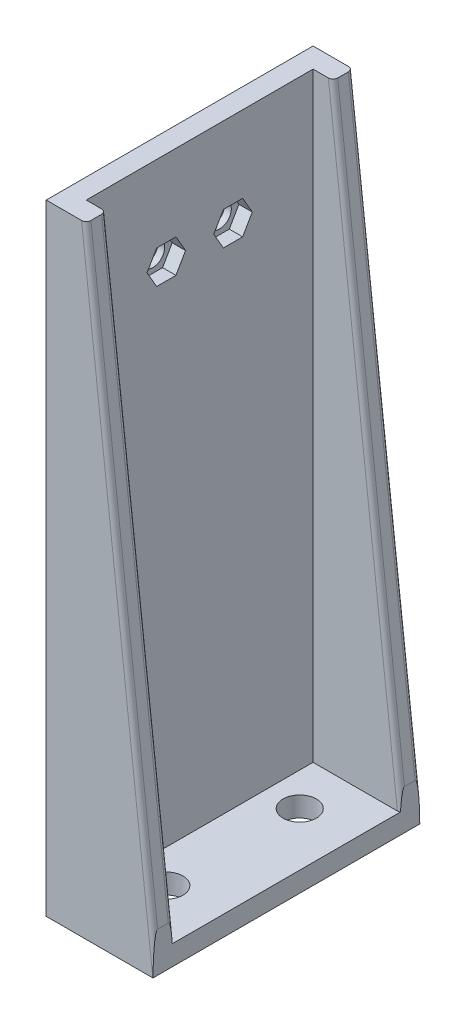
ISO-10303-21;
HEADER;
FILE_DESCRIPTION(('STEP AP214'),'2;1');
FILE_NAME('part.step','',(''),(''),'','','');
FILE_SCHEMA(('AUTOMOTIVE_DESIGN { 1 0 10303 214 1 1 1 1 }'));
ENDSEC;
DATA;
#1=APPLICATION_CONTEXT('core data for automotive mechanical design processes');
#2=APPLICATION_PROTOCOL_DEFINITION('international standard','automotive_design',2000,#1);
#3=PRODUCT_CONTEXT('',#1,'mechanical');
#4=PRODUCT('Part','Part','',(#3));
#5=PRODUCT_RELATED_PRODUCT_CATEGORY('part','',(#4));
#6=PRODUCT_DEFINITION_FORMATION('','',#4);
#7=PRODUCT_DEFINITION_CONTEXT('part definition',#1,'design');
#8=PRODUCT_DEFINITION('design','',#6,#7);
#9=PRODUCT_DEFINITION_SHAPE('','',#8);
#10=(LENGTH_UNIT() NAMED_UNIT(*) SI_UNIT(.MILLI.,.METRE.));
#11=(NAMED_UNIT(*) PLANE_ANGLE_UNIT() SI_UNIT($,.RADIAN.));
#12=(NAMED_UNIT(*) SI_UNIT($,.STERADIAN.) SOLID_ANGLE_UNIT());
#13=UNCERTAINTY_MEASURE_WITH_UNIT(LENGTH_MEASURE(1.E-05),#10,'distance_accuracy_value','');
#14=(GEOMETRIC_REPRESENTATION_CONTEXT(3) GLOBAL_UNCERTAINTY_ASSIGNED_CONTEXT((#13)) GLOBAL_UNIT_ASSIGNED_CONTEXT((#10,
#11,#12)) REPRESENTATION_CONTEXT('',''));
#15=CARTESIAN_POINT('',(0.,0.,0.));
#16=DIRECTION('',(0.,0.,1.));
#17=DIRECTION('',(1.,0.,0.));
#18=AXIS2_PLACEMENT_3D('',#15,#16,#17);
#19=CARTESIAN_POINT('',(0.,3.,0.));
#20=DIRECTION('',(0.,0.,-1.));
#21=DIRECTION('',(-1.,0.,0.));
#22=AXIS2_PLACEMENT_3D('',#19,#20,#21);
#23=PLANE('',#22);
#24=DIRECTION('',(1.,0.,0.));
#25=VECTOR('',#24,1.);
#26=CARTESIAN_POINT('',(0.,0.,0.));
#27=LINE('',#26,#25);
#28=CARTESIAN_POINT('',(-8.,0.,0.));
#29=VERTEX_POINT('',#28);
#30=CARTESIAN_POINT('',(7.98504622086198,0.,0.));
#31=VERTEX_POINT('',#30);
#32=EDGE_CURVE('E414',#29,#31,#27,.T.);
#33=ORIENTED_EDGE('',*,*,#32,.T.);
#34=DIRECTION('',(0.114190672624496,-0.993458851833112,0.));
#35=VECTOR('',#34,1.);
#36=CARTESIAN_POINT('',(-2.69542119628317,92.9200665291629,0.));
#37=LINE('',#36,#35);
#38=CARTESIAN_POINT('',(-2.70460895155181,93.,0.));
#39=VERTEX_POINT('',#38);
#40=EDGE_CURVE('E500',#31,#39,#37,.F.);
#41=ORIENTED_EDGE('',*,*,#40,.T.);
#42=DIRECTION('',(1.,0.,0.));
#43=VECTOR('',#42,1.);
#44=CARTESIAN_POINT('',(0.,93.,0.));
#45=LINE('',#44,#43);
#46=CARTESIAN_POINT('',(-8.,93.,0.));
#47=VERTEX_POINT('',#46);
#48=EDGE_CURVE('E464',#47,#39,#45,.T.);
#49=ORIENTED_EDGE('',*,*,#48,.F.);
#50=DIRECTION('',(0.,-1.,0.));
#51=VECTOR('',#50,1.);
#52=CARTESIAN_POINT('',(-8.,3.,0.));
#53=LINE('',#52,#51);
#54=EDGE_CURVE('E397',#47,#29,#53,.T.);
#55=ORIENTED_EDGE('',*,*,#54,.T.);
#56=EDGE_LOOP('',(#33,#41,#49,#55));
#57=FACE_BOUND('',#56,.T.);
#58=ADVANCED_FACE('F43',(#57),#23,.F.);
#59=CARTESIAN_POINT('',(8.,3.,0.));
#60=DIRECTION('',(-1.,0.,0.));
#61=DIRECTION('',(0.,0.,1.));
#62=AXIS2_PLACEMENT_3D('',#59,#60,#61);
#63=PLANE('',#62);
#64=DIRECTION('',(0.,0.,-1.));
#65=VECTOR('',#64,1.);
#66=CARTESIAN_POINT('',(8.,0.,0.));
#67=LINE('',#66,#65);
#68=CARTESIAN_POINT('',(8.,0.,-0.00015766037906016));
#69=VERTEX_POINT('',#68);
#70=CARTESIAN_POINT('',(8.,0.,-39.9998423396209));
#71=VERTEX_POINT('',#70);
#72=EDGE_CURVE('E410',#69,#71,#67,.T.);
#73=ORIENTED_EDGE('',*,*,#72,.T.);
#74=CARTESIAN_POINT('',(8.,-0.130097878500801,-39.3));
#75=DIRECTION('',(-1.,0.,0.));
#76=DIRECTION('',(0.,-1.,0.));
#77=AXIS2_PLACEMENT_3D('',#74,#75,#76);
#78=ELLIPSE('',#77,6.1300978785008,0.7);
#79=CARTESIAN_POINT('',(8.,5.99999999999999,-39.3));
#80=VERTEX_POINT('',#79);
#81=EDGE_CURVE('E535',#71,#80,#78,.F.);
#82=ORIENTED_EDGE('',*,*,#81,.T.);
#83=DIRECTION('',(0.,0.,-1.));
#84=VECTOR('',#83,1.);
#85=CARTESIAN_POINT('',(8.00000000000001,5.99999999999999,0.));
#86=LINE('',#85,#84);
#87=CARTESIAN_POINT('',(8.,5.99999999999999,-37.7));
#88=VERTEX_POINT('',#87);
#89=EDGE_CURVE('E321',#88,#80,#86,.T.);
#90=ORIENTED_EDGE('',*,*,#89,.F.);
#91=CARTESIAN_POINT('',(8.,-0.130097878500797,-37.7));
#92=DIRECTION('',(-1.,0.,0.));
#93=DIRECTION('',(0.,1.,0.));
#94=AXIS2_PLACEMENT_3D('',#91,#92,#93);
#95=ELLIPSE('',#94,6.1300978785008,0.7);
#96=CARTESIAN_POINT('',(8.,3.,-37.0981318769091));
#97=VERTEX_POINT('',#96);
#98=EDGE_CURVE('E538',#88,#97,#95,.F.);
#99=ORIENTED_EDGE('',*,*,#98,.T.);
#100=DIRECTION('',(0.,0.,-1.));
#101=VECTOR('',#100,1.);
#102=CARTESIAN_POINT('',(8.,3.,0.));
#103=LINE('',#102,#101);
#104=CARTESIAN_POINT('',(8.,3.,-2.90186812309091));
#105=VERTEX_POINT('',#104);
#106=EDGE_CURVE('E400',#105,#97,#103,.T.);
#107=ORIENTED_EDGE('',*,*,#106,.F.);
#108=CARTESIAN_POINT('',(8.,-0.130097878500754,-2.3));
#109=DIRECTION('',(-1.,0.,0.));
#110=DIRECTION('',(0.,-1.,0.));
#111=AXIS2_PLACEMENT_3D('',#108,#109,#110);
#112=ELLIPSE('',#111,6.1300978785008,0.7);
#113=CARTESIAN_POINT('',(8.00000000000001,5.99999999999999,-2.3));
#114=VERTEX_POINT('',#113);
#115=EDGE_CURVE('E337',#105,#114,#112,.F.);
#116=ORIENTED_EDGE('',*,*,#115,.T.);
#117=CARTESIAN_POINT('',(8.00000000000001,5.99999999999999,-0.700000000000001));
#118=VERTEX_POINT('',#117);
#119=EDGE_CURVE('E330',#118,#114,#86,.T.);
#120=ORIENTED_EDGE('',*,*,#119,.F.);
#121=CARTESIAN_POINT('',(8.,-0.130097878500748,-0.700000000000001));
#122=DIRECTION('',(-1.,0.,0.));
#123=DIRECTION('',(0.,1.,0.));
#124=AXIS2_PLACEMENT_3D('',#121,#122,#123);
#125=ELLIPSE('',#124,6.1300978785008,0.7);
#126=EDGE_CURVE('E498',#118,#69,#125,.F.);
#127=ORIENTED_EDGE('',*,*,#126,.T.);
#128=EDGE_LOOP('',(#73,#82,#90,#99,#107,#116,#120,#127));
#129=FACE_BOUND('',#128,.T.);
#130=ADVANCED_FACE('F546',(#129),#63,.F.);
#131=CARTESIAN_POINT('',(0.,3.,-40.));
#132=DIRECTION('',(0.,0.,-1.));
#133=DIRECTION('',(-1.,0.,0.));
#134=AXIS2_PLACEMENT_3D('',#131,#132,#133);
#135=PLANE('',#134);
#136=DIRECTION('',(-1.,0.,0.));
#137=VECTOR('',#136,1.);
#138=CARTESIAN_POINT('',(0.,93.,-40.));
#139=LINE('',#138,#137);
#140=CARTESIAN_POINT('',(-2.70460895155182,93.,-40.));
#141=VERTEX_POINT('',#140);
#142=CARTESIAN_POINT('',(-8.,93.,-40.));
#143=VERTEX_POINT('',#142);
#144=EDGE_CURVE('E324',#141,#143,#139,.T.);
#145=ORIENTED_EDGE('',*,*,#144,.F.);
#146=DIRECTION('',(0.114190672624496,-0.993458851833112,0.));
#147=VECTOR('',#146,1.);
#148=CARTESIAN_POINT('',(7.54059392954809,3.86673493443081,-40.));
#149=LINE('',#148,#147);
#150=CARTESIAN_POINT('',(7.98504622086197,0.,-40.));
#151=VERTEX_POINT('',#150);
#152=EDGE_CURVE('E341',#141,#151,#149,.T.);
#153=ORIENTED_EDGE('',*,*,#152,.T.);
#154=DIRECTION('',(1.,0.,0.));
#155=VECTOR('',#154,1.);
#156=CARTESIAN_POINT('',(0.,0.,-40.));
#157=LINE('',#156,#155);
#158=CARTESIAN_POINT('',(-8.,0.,-40.));
#159=VERTEX_POINT('',#158);
#160=EDGE_CURVE('E406',#159,#151,#157,.T.);
#161=ORIENTED_EDGE('',*,*,#160,.F.);
#162=DIRECTION('',(0.,-1.,0.));
#163=VECTOR('',#162,1.);
#164=CARTESIAN_POINT('',(-8.,3.,-40.));
#165=LINE('',#164,#163);
#166=EDGE_CURVE('E394',#143,#159,#165,.T.);
#167=ORIENTED_EDGE('',*,*,#166,.F.);
#168=EDGE_LOOP('',(#145,#153,#161,#167));
#169=FACE_BOUND('',#168,.T.);
#170=ADVANCED_FACE('F482',(#169),#135,.T.);
#171=CARTESIAN_POINT('',(0.,93.,-3.));
#172=DIRECTION('',(0.,0.,-1.));
#173=DIRECTION('',(-1.,0.,0.));
#174=AXIS2_PLACEMENT_3D('',#171,#172,#173);
#175=PLANE('',#174);
#176=DIRECTION('',(1.,0.,0.));
#177=VECTOR('',#176,1.);
#178=CARTESIAN_POINT('',(0.,93.,-3.));
#179=LINE('',#178,#177);
#180=CARTESIAN_POINT('',(-5.,93.,-3.));
#181=VERTEX_POINT('',#180);
#182=CARTESIAN_POINT('',(-2.70460895155181,93.,-3.));
#183=VERTEX_POINT('',#182);
#184=EDGE_CURVE('E460',#181,#183,#179,.T.);
#185=ORIENTED_EDGE('',*,*,#184,.T.);
#186=DIRECTION('',(0.114190672624496,-0.993458851833112,0.));
#187=VECTOR('',#186,1.);
#188=CARTESIAN_POINT('',(-2.6693421768543,92.6931790601317,-3.));
#189=LINE('',#188,#187);
#190=CARTESIAN_POINT('',(7.64021863465509,3.,-3.));
#191=VERTEX_POINT('',#190);
#192=EDGE_CURVE('E503',#183,#191,#189,.T.);
#193=ORIENTED_EDGE('',*,*,#192,.T.);
#194=DIRECTION('',(-1.,0.,0.));
#195=VECTOR('',#194,1.);
#196=CARTESIAN_POINT('',(0.,3.,-3.));
#197=LINE('',#196,#195);
#198=CARTESIAN_POINT('',(-5.,3.,-3.));
#199=VERTEX_POINT('',#198);
#200=EDGE_CURVE('E426',#191,#199,#197,.T.);
#201=ORIENTED_EDGE('',*,*,#200,.T.);
#202=DIRECTION('',(0.,-1.,0.));
#203=VECTOR('',#202,1.);
#204=CARTESIAN_POINT('',(-5.,93.,-3.));
#205=LINE('',#204,#203);
#206=EDGE_CURVE('E445',#181,#199,#205,.T.);
#207=ORIENTED_EDGE('',*,*,#206,.F.);
#208=EDGE_LOOP('',(#185,#193,#201,#207));
#209=FACE_BOUND('',#208,.T.);
#210=ADVANCED_FACE('F554',(#209),#175,.T.);
#211=CARTESIAN_POINT('',(0.,93.,-37.));
#212=DIRECTION('',(0.,0.,-1.));
#213=DIRECTION('',(-1.,0.,0.));
#214=AXIS2_PLACEMENT_3D('',#211,#212,#213);
#215=PLANE('',#214);
#216=DIRECTION('',(-1.,0.,0.));
#217=VECTOR('',#216,1.);
#218=CARTESIAN_POINT('',(0.,3.,-37.));
#219=LINE('',#218,#217);
#220=CARTESIAN_POINT('',(7.64021863465508,3.,-37.));
#221=VERTEX_POINT('',#220);
#222=CARTESIAN_POINT('',(-5.,3.,-37.));
#223=VERTEX_POINT('',#222);
#224=EDGE_CURVE('E442',#221,#223,#219,.T.);
#225=ORIENTED_EDGE('',*,*,#224,.F.);
#226=DIRECTION('',(0.114190672624496,-0.993458851833112,0.));
#227=VECTOR('',#226,1.);
#228=CARTESIAN_POINT('',(-2.69542119628319,92.9200665291629,-37.));
#229=LINE('',#228,#227);
#230=CARTESIAN_POINT('',(-2.70460895155182,93.,-37.));
#231=VERTEX_POINT('',#230);
#232=EDGE_CURVE('E515',#221,#231,#229,.F.);
#233=ORIENTED_EDGE('',*,*,#232,.T.);
#234=DIRECTION('',(1.,0.,0.));
#235=VECTOR('',#234,1.);
#236=CARTESIAN_POINT('',(0.,93.,-37.));
#237=LINE('',#236,#235);
#238=CARTESIAN_POINT('',(-5.,93.,-37.));
#239=VERTEX_POINT('',#238);
#240=EDGE_CURVE('E453',#239,#231,#237,.T.);
#241=ORIENTED_EDGE('',*,*,#240,.F.);
#242=DIRECTION('',(0.,-1.,0.));
#243=VECTOR('',#242,1.);
#244=CARTESIAN_POINT('',(-5.,93.,-37.));
#245=LINE('',#244,#243);
#246=EDGE_CURVE('E449',#239,#223,#245,.T.);
#247=ORIENTED_EDGE('',*,*,#246,.T.);
#248=EDGE_LOOP('',(#225,#233,#241,#247));
#249=FACE_BOUND('',#248,.T.);
#250=ADVANCED_FACE('F630',(#249),#215,.F.);
#251=CARTESIAN_POINT('',(0.,93.,0.));
#252=DIRECTION('',(0.,1.,0.));
#253=DIRECTION('',(0.,0.,1.));
#254=AXIS2_PLACEMENT_3D('',#251,#252,#253);
#255=PLANE('',#254);
#256=DIRECTION('',(0.,0.,-1.));
#257=VECTOR('',#256,1.);
#258=CARTESIAN_POINT('',(-1.99999999999999,93.,0.));
#259=LINE('',#258,#257);
#260=CARTESIAN_POINT('',(-2.,93.,-37.7));
#261=VERTEX_POINT('',#260);
#262=CARTESIAN_POINT('',(-2.,93.,-39.3));
#263=VERTEX_POINT('',#262);
#264=EDGE_CURVE('E390',#261,#263,#259,.T.);
#265=ORIENTED_EDGE('',*,*,#264,.T.);
#266=CARTESIAN_POINT('',(-2.70460895155182,93.,-39.3));
#267=DIRECTION('',(0.,1.,0.));
#268=DIRECTION('',(1.,0.,0.));
#269=AXIS2_PLACEMENT_3D('',#266,#267,#268);
#270=ELLIPSE('',#269,0.704608951551816,0.7);
#271=EDGE_CURVE('E478',#263,#141,#270,.T.);
#272=ORIENTED_EDGE('',*,*,#271,.T.);
#273=ORIENTED_EDGE('',*,*,#144,.T.);
#274=DIRECTION('',(0.,0.,1.));
#275=VECTOR('',#274,1.);
#276=CARTESIAN_POINT('',(-8.,93.,0.));
#277=LINE('',#276,#275);
#278=EDGE_CURVE('E467',#143,#47,#277,.T.);
#279=ORIENTED_EDGE('',*,*,#278,.T.);
#280=ORIENTED_EDGE('',*,*,#48,.T.);
#281=CARTESIAN_POINT('',(-2.70460895155181,93.,-0.699999999999999));
#282=DIRECTION('',(0.,1.,0.));
#283=DIRECTION('',(-1.,0.,0.));
#284=AXIS2_PLACEMENT_3D('',#281,#282,#283);
#285=ELLIPSE('',#284,0.704608951551816,0.7);
#286=CARTESIAN_POINT('',(-1.99999999999999,93.,-0.7));
#287=VERTEX_POINT('',#286);
#288=EDGE_CURVE('E501',#39,#287,#285,.T.);
#289=ORIENTED_EDGE('',*,*,#288,.T.);
#290=DIRECTION('',(0.,0.,-1.));
#291=VECTOR('',#290,1.);
#292=CARTESIAN_POINT('',(-1.99999999999999,93.,0.));
#293=LINE('',#292,#291);
#294=CARTESIAN_POINT('',(-1.99999999999999,93.,-2.3));
#295=VERTEX_POINT('',#294);
#296=EDGE_CURVE('E268',#287,#295,#293,.T.);
#297=ORIENTED_EDGE('',*,*,#296,.T.);
#298=CARTESIAN_POINT('',(-2.70460895155181,93.,-2.3));
#299=DIRECTION('',(0.,1.,0.));
#300=DIRECTION('',(1.,0.,0.));
#301=AXIS2_PLACEMENT_3D('',#298,#299,#300);
#302=ELLIPSE('',#301,0.704608951551816,0.7);
#303=EDGE_CURVE('E525',#295,#183,#302,.T.);
#304=ORIENTED_EDGE('',*,*,#303,.T.);
#305=ORIENTED_EDGE('',*,*,#184,.F.);
#306=DIRECTION('',(0.,0.,-1.));
#307=VECTOR('',#306,1.);
#308=CARTESIAN_POINT('',(-5.,93.,0.));
#309=LINE('',#308,#307);
#310=EDGE_CURVE('E457',#181,#239,#309,.T.);
#311=ORIENTED_EDGE('',*,*,#310,.T.);
#312=ORIENTED_EDGE('',*,*,#240,.T.);
#313=CARTESIAN_POINT('',(-2.70460895155182,93.,-37.7));
#314=DIRECTION('',(0.,1.,0.));
#315=DIRECTION('',(-1.,0.,0.));
#316=AXIS2_PLACEMENT_3D('',#313,#314,#315);
#317=ELLIPSE('',#316,0.704608951551816,0.7);
#318=EDGE_CURVE('E520',#231,#261,#317,.T.);
#319=ORIENTED_EDGE('',*,*,#318,.T.);
#320=EDGE_LOOP('',(#265,#272,#273,#279,#280,#289,#297,#304,#305,#311,#312,#319));
#321=FACE_BOUND('',#320,.T.);
#322=ADVANCED_FACE('F476',(#321),#255,.T.);
#323=CARTESIAN_POINT('',(0.,3.,-30.));
#324=DIRECTION('',(0.,-1.,0.));
#325=DIRECTION('',(0.,0.,-1.));
#326=AXIS2_PLACEMENT_3D('',#323,#324,#325);
#327=CYLINDRICAL_SURFACE('',#326,2.5);
#328=CARTESIAN_POINT('',(0.,3.,-30.));
#329=DIRECTION('',(0.,1.,0.));
#330=DIRECTION('',(0.,0.,1.));
#331=AXIS2_PLACEMENT_3D('',#328,#329,#330);
#332=CIRCLE('',#331,2.5);
#333=CARTESIAN_POINT('',(0.,3.,-27.5));
#334=VERTEX_POINT('',#333);
#335=EDGE_CURVE('E429',#334,#334,#332,.T.);
#336=ORIENTED_EDGE('',*,*,#335,.T.);
#337=EDGE_LOOP('',(#336));
#338=FACE_BOUND('',#337,.T.);
#339=CARTESIAN_POINT('',(0.,0.,-30.));
#340=DIRECTION('',(0.,1.,0.));
#341=DIRECTION('',(0.,0.,1.));
#342=AXIS2_PLACEMENT_3D('',#339,#340,#341);
#343=CIRCLE('',#342,2.5);
#344=CARTESIAN_POINT('',(0.,0.,-27.5));
#345=VERTEX_POINT('',#344);
#346=EDGE_CURVE('E418',#345,#345,#343,.T.);
#347=ORIENTED_EDGE('',*,*,#346,.F.);
#348=EDGE_LOOP('',(#347));
#349=FACE_BOUND('',#348,.T.);
#350=ADVANCED_FACE('F598',(#338,#349),#327,.F.);
#351=CARTESIAN_POINT('',(0.,3.,-10.));
#352=DIRECTION('',(0.,-1.,0.));
#353=DIRECTION('',(0.,0.,-1.));
#354=AXIS2_PLACEMENT_3D('',#351,#352,#353);
#355=CYLINDRICAL_SURFACE('',#354,2.5);
#356=CARTESIAN_POINT('',(0.,3.,-10.));
#357=DIRECTION('',(0.,1.,0.));
#358=DIRECTION('',(0.,0.,1.));
#359=AXIS2_PLACEMENT_3D('',#356,#357,#358);
#360=CIRCLE('',#359,2.5);
#361=CARTESIAN_POINT('',(0.,3.,-7.5));
#362=VERTEX_POINT('',#361);
#363=EDGE_CURVE('E405',#362,#362,#360,.T.);
#364=ORIENTED_EDGE('',*,*,#363,.T.);
#365=EDGE_LOOP('',(#364));
#366=FACE_BOUND('',#365,.T.);
#367=CARTESIAN_POINT('',(0.,0.,-10.));
#368=DIRECTION('',(0.,1.,0.));
#369=DIRECTION('',(0.,0.,1.));
#370=AXIS2_PLACEMENT_3D('',#367,#368,#369);
#371=CIRCLE('',#370,2.5);
#372=CARTESIAN_POINT('',(0.,0.,-7.5));
#373=VERTEX_POINT('',#372);
#374=EDGE_CURVE('E422',#373,#373,#371,.T.);
#375=ORIENTED_EDGE('',*,*,#374,.F.);
#376=EDGE_LOOP('',(#375));
#377=FACE_BOUND('',#376,.T.);
#378=ADVANCED_FACE('F600',(#366,#377),#355,.F.);
#379=CARTESIAN_POINT('',(-8.,3.,0.));
#380=DIRECTION('',(-1.,0.,0.));
#381=DIRECTION('',(0.,0.,1.));
#382=AXIS2_PLACEMENT_3D('',#379,#380,#381);
#383=PLANE('',#382);
#384=CARTESIAN_POINT('',(-8.,79.,-25.));
#385=DIRECTION('',(-1.,0.,0.));
#386=DIRECTION('',(0.,0.,1.));
#387=AXIS2_PLACEMENT_3D('',#384,#385,#386);
#388=CIRCLE('',#387,1.75);
#389=CARTESIAN_POINT('',(-8.,79.,-23.25));
#390=VERTEX_POINT('',#389);
#391=EDGE_CURVE('E703',#390,#390,#388,.T.);
#392=ORIENTED_EDGE('',*,*,#391,.F.);
#393=EDGE_LOOP('',(#392));
#394=FACE_BOUND('',#393,.T.);
#395=CARTESIAN_POINT('',(-8.,79.,-15.));
#396=DIRECTION('',(-1.,0.,0.));
#397=DIRECTION('',(0.,0.,1.));
#398=AXIS2_PLACEMENT_3D('',#395,#396,#397);
#399=CIRCLE('',#398,1.75);
#400=CARTESIAN_POINT('',(-8.,79.,-13.25));
#401=VERTEX_POINT('',#400);
#402=EDGE_CURVE('E698',#401,#401,#399,.T.);
#403=ORIENTED_EDGE('',*,*,#402,.F.);
#404=EDGE_LOOP('',(#403));
#405=FACE_BOUND('',#404,.T.);
#406=DIRECTION('',(0.,0.,-1.));
#407=VECTOR('',#406,1.);
#408=CARTESIAN_POINT('',(-8.,0.,0.));
#409=LINE('',#408,#407);
#410=EDGE_CURVE('E401',#29,#159,#409,.T.);
#411=ORIENTED_EDGE('',*,*,#410,.F.);
#412=ORIENTED_EDGE('',*,*,#54,.F.);
#413=ORIENTED_EDGE('',*,*,#278,.F.);
#414=ORIENTED_EDGE('',*,*,#166,.T.);
#415=EDGE_LOOP('',(#411,#412,#413,#414));
#416=FACE_BOUND('',#415,.T.);
#417=ADVANCED_FACE('F485',(#394,#405,#416),#383,.T.);
#418=CARTESIAN_POINT('',(0.,3.,0.));
#419=DIRECTION('',(0.,1.,0.));
#420=DIRECTION('',(0.,0.,1.));
#421=AXIS2_PLACEMENT_3D('',#418,#419,#420);
#422=PLANE('',#421);
#423=ORIENTED_EDGE('',*,*,#200,.F.);
#424=CARTESIAN_POINT('',(7.64021863465509,3.,-2.3));
#425=DIRECTION('',(0.,1.,0.));
#426=DIRECTION('',(1.,0.,0.));
#427=AXIS2_PLACEMENT_3D('',#424,#425,#426);
#428=ELLIPSE('',#427,0.704608951551816,0.7);
#429=EDGE_CURVE('E11',#191,#105,#428,.F.);
#430=ORIENTED_EDGE('',*,*,#429,.T.);
#431=ORIENTED_EDGE('',*,*,#106,.T.);
#432=CARTESIAN_POINT('',(7.64021863465508,3.,-37.7));
#433=DIRECTION('',(0.,1.,0.));
#434=DIRECTION('',(-1.,0.,0.));
#435=AXIS2_PLACEMENT_3D('',#432,#433,#434);
#436=ELLIPSE('',#435,0.704608951551816,0.7);
#437=EDGE_CURVE('E52',#97,#221,#436,.F.);
#438=ORIENTED_EDGE('',*,*,#437,.T.);
#439=ORIENTED_EDGE('',*,*,#224,.T.);
#440=DIRECTION('',(0.,0.,1.));
#441=VECTOR('',#440,1.);
#442=CARTESIAN_POINT('',(-5.,3.,0.));
#443=LINE('',#442,#441);
#444=EDGE_CURVE('E438',#223,#199,#443,.T.);
#445=ORIENTED_EDGE('',*,*,#444,.T.);
#446=EDGE_LOOP('',(#423,#430,#431,#438,#439,#445));
#447=FACE_BOUND('',#446,.T.);
#448=ORIENTED_EDGE('',*,*,#363,.F.);
#449=EDGE_LOOP('',(#448));
#450=FACE_BOUND('',#449,.T.);
#451=ORIENTED_EDGE('',*,*,#335,.F.);
#452=EDGE_LOOP('',(#451));
#453=FACE_BOUND('',#452,.T.);
#454=ADVANCED_FACE('F607',(#447,#450,#453),#422,.T.);
#455=CARTESIAN_POINT('',(0.,0.,0.));
#456=DIRECTION('',(0.,1.,0.));
#457=DIRECTION('',(0.,0.,1.));
#458=AXIS2_PLACEMENT_3D('',#455,#456,#457);
#459=PLANE('',#458);
#460=ORIENTED_EDGE('',*,*,#160,.T.);
#461=CARTESIAN_POINT('',(7.98504622086197,0.,-39.3));
#462=DIRECTION('',(0.,1.,0.));
#463=DIRECTION('',(1.,0.,0.));
#464=AXIS2_PLACEMENT_3D('',#461,#462,#463);
#465=ELLIPSE('',#464,0.704608951551816,0.7);
#466=EDGE_CURVE('E334',#151,#71,#465,.F.);
#467=ORIENTED_EDGE('',*,*,#466,.T.);
#468=ORIENTED_EDGE('',*,*,#72,.F.);
#469=CARTESIAN_POINT('',(7.98504622086198,0.,-0.700000000000001));
#470=DIRECTION('',(0.,1.,0.));
#471=DIRECTION('',(-1.,0.,0.));
#472=AXIS2_PLACEMENT_3D('',#469,#470,#471);
#473=ELLIPSE('',#472,0.704608951551816,0.7);
#474=EDGE_CURVE('E338',#69,#31,#473,.F.);
#475=ORIENTED_EDGE('',*,*,#474,.T.);
#476=ORIENTED_EDGE('',*,*,#32,.F.);
#477=ORIENTED_EDGE('',*,*,#410,.T.);
#478=EDGE_LOOP('',(#460,#467,#468,#475,#476,#477));
#479=FACE_BOUND('',#478,.T.);
#480=ORIENTED_EDGE('',*,*,#374,.T.);
#481=EDGE_LOOP('',(#480));
#482=FACE_BOUND('',#481,.T.);
#483=ORIENTED_EDGE('',*,*,#346,.T.);
#484=EDGE_LOOP('',(#483));
#485=FACE_BOUND('',#484,.T.);
#486=ADVANCED_FACE('F490',(#479,#482,#485),#459,.F.);
#487=CARTESIAN_POINT('',(-5.,93.,0.));
#488=DIRECTION('',(-1.,0.,0.));
#489=DIRECTION('',(0.,0.,1.));
#490=AXIS2_PLACEMENT_3D('',#487,#488,#489);
#491=PLANE('',#490);
#492=DIRECTION('',(0.,-0.866025403784439,-0.499999999999999));
#493=VECTOR('',#492,1.);
#494=CARTESIAN_POINT('',(-5.,97.2451905283833,-7.35288568297007));
#495=LINE('',#494,#493);
#496=CARTESIAN_POINT('',(-5.,81.5,-16.4433756729741));
#497=VERTEX_POINT('',#496);
#498=CARTESIAN_POINT('',(-5.,79.,-17.8867513459481));
#499=VERTEX_POINT('',#498);
#500=EDGE_CURVE('E348',#497,#499,#495,.T.);
#501=ORIENTED_EDGE('',*,*,#500,.T.);
#502=DIRECTION('',(0.,-0.866025403784437,0.500000000000003));
#503=VECTOR('',#502,1.);
#504=CARTESIAN_POINT('',(-5.,81.7548094716166,-19.4772413359522));
#505=LINE('',#504,#503);
#506=CARTESIAN_POINT('',(-5.,76.5,-16.4433756729741));
#507=VERTEX_POINT('',#506);
#508=EDGE_CURVE('E345',#499,#507,#505,.T.);
#509=ORIENTED_EDGE('',*,*,#508,.T.);
#510=DIRECTION('',(0.,0.,1.));
#511=VECTOR('',#510,1.);
#512=CARTESIAN_POINT('',(-5.,76.5,0.));
#513=LINE('',#512,#511);
#514=CARTESIAN_POINT('',(-5.,76.5,-13.5566243270259));
#515=VERTEX_POINT('',#514);
#516=EDGE_CURVE('E221',#507,#515,#513,.T.);
#517=ORIENTED_EDGE('',*,*,#516,.T.);
#518=DIRECTION('',(0.,0.866025403784439,0.499999999999999));
#519=VECTOR('',#518,1.);
#520=CARTESIAN_POINT('',(-5.,94.7451905283833,-3.02275866404785));
#521=LINE('',#520,#519);
#522=CARTESIAN_POINT('',(-5.,79.,-12.1132486540519));
#523=VERTEX_POINT('',#522);
#524=EDGE_CURVE('E360',#515,#523,#521,.T.);
#525=ORIENTED_EDGE('',*,*,#524,.T.);
#526=DIRECTION('',(0.,0.866025403784438,-0.500000000000001));
#527=VECTOR('',#526,1.);
#528=CARTESIAN_POINT('',(-5.,84.2548094716167,-15.14711431703));
#529=LINE('',#528,#527);
#530=CARTESIAN_POINT('',(-5.,81.5,-13.556624327026));
#531=VERTEX_POINT('',#530);
#532=EDGE_CURVE('E356',#523,#531,#529,.T.);
#533=ORIENTED_EDGE('',*,*,#532,.T.);
#534=DIRECTION('',(0.,0.,-1.));
#535=VECTOR('',#534,1.);
#536=CARTESIAN_POINT('',(-5.,81.5,0.));
#537=LINE('',#536,#535);
#538=EDGE_CURVE('E352',#531,#497,#537,.T.);
#539=ORIENTED_EDGE('',*,*,#538,.T.);
#540=EDGE_LOOP('',(#501,#509,#517,#525,#533,#539));
#541=FACE_BOUND('',#540,.T.);
#542=DIRECTION('',(0.,-0.866025403784439,-0.499999999999999));
#543=VECTOR('',#542,1.);
#544=CARTESIAN_POINT('',(-5.,101.575317547305,-14.85288568297));
#545=LINE('',#544,#543);
#546=CARTESIAN_POINT('',(-5.,81.5,-26.443375672974));
#547=VERTEX_POINT('',#546);
#548=CARTESIAN_POINT('',(-5.,79.,-27.8867513459481));
#549=VERTEX_POINT('',#548);
#550=EDGE_CURVE('E370',#547,#549,#545,.T.);
#551=ORIENTED_EDGE('',*,*,#550,.T.);
#552=DIRECTION('',(0.,-0.866025403784439,0.499999999999999));
#553=VECTOR('',#552,1.);
#554=CARTESIAN_POINT('',(-5.,77.4246824526945,-26.9772413359522));
#555=LINE('',#554,#553);
#556=CARTESIAN_POINT('',(-5.,76.5,-26.443375672974));
#557=VERTEX_POINT('',#556);
#558=EDGE_CURVE('E366',#549,#557,#555,.T.);
#559=ORIENTED_EDGE('',*,*,#558,.T.);
#560=DIRECTION('',(0.,0.,1.));
#561=VECTOR('',#560,1.);
#562=CARTESIAN_POINT('',(-5.,76.5,0.));
#563=LINE('',#562,#561);
#564=CARTESIAN_POINT('',(-5.,76.5,-23.5566243270259));
#565=VERTEX_POINT('',#564);
#566=EDGE_CURVE('E386',#557,#565,#563,.T.);
#567=ORIENTED_EDGE('',*,*,#566,.T.);
#568=DIRECTION('',(0.,0.866025403784439,0.5));
#569=VECTOR('',#568,1.);
#570=CARTESIAN_POINT('',(-5.,99.0753175473055,-10.5227586640478));
#571=LINE('',#570,#569);
#572=CARTESIAN_POINT('',(-5.,79.,-22.1132486540518));
#573=VERTEX_POINT('',#572);
#574=EDGE_CURVE('E382',#565,#573,#571,.T.);
#575=ORIENTED_EDGE('',*,*,#574,.T.);
#576=DIRECTION('',(0.,0.866025403784439,-0.5));
#577=VECTOR('',#576,1.);
#578=CARTESIAN_POINT('',(-5.,79.9246824526945,-22.6471143170299));
#579=LINE('',#578,#577);
#580=CARTESIAN_POINT('',(-5.,81.5,-23.5566243270259));
#581=VERTEX_POINT('',#580);
#582=EDGE_CURVE('E378',#573,#581,#579,.T.);
#583=ORIENTED_EDGE('',*,*,#582,.T.);
#584=DIRECTION('',(0.,0.,-1.));
#585=VECTOR('',#584,1.);
#586=CARTESIAN_POINT('',(-5.,81.5,0.));
#587=LINE('',#586,#585);
#588=EDGE_CURVE('E374',#581,#547,#587,.T.);
#589=ORIENTED_EDGE('',*,*,#588,.T.);
#590=EDGE_LOOP('',(#551,#559,#567,#575,#583,#589));
#591=FACE_BOUND('',#590,.T.);
#592=ORIENTED_EDGE('',*,*,#444,.F.);
#593=ORIENTED_EDGE('',*,*,#246,.F.);
#594=ORIENTED_EDGE('',*,*,#310,.F.);
#595=ORIENTED_EDGE('',*,*,#206,.T.);
#596=EDGE_LOOP('',(#592,#593,#594,#595));
#597=FACE_BOUND('',#596,.T.);
#598=ADVANCED_FACE('F560',(#541,#591,#597),#491,.F.);
#599=CARTESIAN_POINT('',(8.57634632937802,0.985786934411267,0.));
#600=DIRECTION('',(0.993458851833112,0.114190672624496,0.));
#601=DIRECTION('',(-0.114190672624496,0.993458851833112,0.));
#602=AXIS2_PLACEMENT_3D('',#599,#600,#601);
#603=PLANE('',#602);
#604=ORIENTED_EDGE('',*,*,#89,.T.);
#605=DIRECTION('',(0.114190672624496,-0.993458851833112,0.));
#606=VECTOR('',#605,1.);
#607=CARTESIAN_POINT('',(8.57634632937801,0.985786934411266,-39.3));
#608=LINE('',#607,#606);
#609=EDGE_CURVE('E528',#80,#263,#608,.F.);
#610=ORIENTED_EDGE('',*,*,#609,.T.);
#611=ORIENTED_EDGE('',*,*,#264,.F.);
#612=DIRECTION('',(0.114190672624496,-0.993458851833112,0.));
#613=VECTOR('',#612,1.);
#614=CARTESIAN_POINT('',(8.,5.99999999999999,-37.7));
#615=LINE('',#614,#613);
#616=EDGE_CURVE('E531',#261,#88,#615,.T.);
#617=ORIENTED_EDGE('',*,*,#616,.T.);
#618=EDGE_LOOP('',(#604,#610,#611,#617));
#619=FACE_BOUND('',#618,.T.);
#620=ADVANCED_FACE('F572',(#619),#603,.T.);
#621=ORIENTED_EDGE('',*,*,#296,.F.);
#622=DIRECTION('',(0.114190672624496,-0.993458851833112,0.));
#623=VECTOR('',#622,1.);
#624=CARTESIAN_POINT('',(8.00000000000001,5.99999999999999,-0.700000000000001));
#625=LINE('',#624,#623);
#626=EDGE_CURVE('E504',#287,#118,#625,.T.);
#627=ORIENTED_EDGE('',*,*,#626,.T.);
#628=ORIENTED_EDGE('',*,*,#119,.T.);
#629=DIRECTION('',(0.114190672624496,-0.993458851833112,0.));
#630=VECTOR('',#629,1.);
#631=CARTESIAN_POINT('',(8.57634632937802,0.985786934411267,-2.3));
#632=LINE('',#631,#630);
#633=EDGE_CURVE('E509',#114,#295,#632,.F.);
#634=ORIENTED_EDGE('',*,*,#633,.T.);
#635=EDGE_LOOP('',(#621,#627,#628,#634));
#636=FACE_BOUND('',#635,.T.);
#637=ADVANCED_FACE('F550',(#636),#603,.T.);
#638=CARTESIAN_POINT('',(8.00005499999999,7.67468245269448,13.2929399400242));
#639=DIRECTION('',(0.,-0.499999999999999,-0.866025403784439));
#640=DIRECTION('',(0.,0.866025403784439,-0.499999999999999));
#641=AXIS2_PLACEMENT_3D('',#638,#639,#640);
#642=PLANE('',#641);
#643=DIRECTION('',(-1.,0.,0.));
#644=VECTOR('',#643,1.);
#645=CARTESIAN_POINT('',(8.00005499999999,79.,-27.8867513459481));
#646=LINE('',#645,#644);
#647=CARTESIAN_POINT('',(-7.,79.,-27.8867513459481));
#648=VERTEX_POINT('',#647);
#649=EDGE_CURVE('E245',#549,#648,#646,.T.);
#650=ORIENTED_EDGE('',*,*,#649,.T.);
#651=DIRECTION('',(0.,-0.866025403784439,0.499999999999999));
#652=VECTOR('',#651,1.);
#653=CARTESIAN_POINT('',(-7.,7.67468245269448,13.2929399400242));
#654=LINE('',#653,#652);
#655=CARTESIAN_POINT('',(-7.,76.5,-26.443375672974));
#656=VERTEX_POINT('',#655);
#657=EDGE_CURVE('E280',#648,#656,#654,.T.);
#658=ORIENTED_EDGE('',*,*,#657,.T.);
#659=DIRECTION('',(-1.,0.,0.));
#660=VECTOR('',#659,1.);
#661=CARTESIAN_POINT('',(8.00005499999999,76.5,-26.443375672974));
#662=LINE('',#661,#660);
#663=EDGE_CURVE('E303',#557,#656,#662,.T.);
#664=ORIENTED_EDGE('',*,*,#663,.F.);
#665=ORIENTED_EDGE('',*,*,#558,.F.);
#666=EDGE_LOOP('',(#650,#658,#664,#665));
#667=FACE_BOUND('',#666,.T.);
#668=ADVANCED_FACE('F640',(#667),#642,.F.);
#669=CARTESIAN_POINT('',(8.00005499999999,31.8253175473054,-55.1230669589464));
#670=DIRECTION('',(0.,0.499999999999999,-0.866025403784439));
#671=DIRECTION('',(0.,0.866025403784439,0.499999999999999));
#672=AXIS2_PLACEMENT_3D('',#669,#670,#671);
#673=PLANE('',#672);
#674=DIRECTION('',(-1.,0.,0.));
#675=VECTOR('',#674,1.);
#676=CARTESIAN_POINT('',(8.00005499999999,81.5,-26.443375672974));
#677=LINE('',#676,#675);
#678=CARTESIAN_POINT('',(-7.,81.5,-26.443375672974));
#679=VERTEX_POINT('',#678);
#680=EDGE_CURVE('E248',#547,#679,#677,.T.);
#681=ORIENTED_EDGE('',*,*,#680,.T.);
#682=DIRECTION('',(0.,-0.866025403784439,-0.499999999999999));
#683=VECTOR('',#682,1.);
#684=CARTESIAN_POINT('',(-7.,31.8253175473054,-55.1230669589464));
#685=LINE('',#684,#683);
#686=EDGE_CURVE('E300',#679,#648,#685,.T.);
#687=ORIENTED_EDGE('',*,*,#686,.T.);
#688=ORIENTED_EDGE('',*,*,#649,.F.);
#689=ORIENTED_EDGE('',*,*,#550,.F.);
#690=EDGE_LOOP('',(#681,#687,#688,#689));
#691=FACE_BOUND('',#690,.T.);
#692=ADVANCED_FACE('F643',(#691),#673,.F.);
#693=CARTESIAN_POINT('',(8.00005499999999,81.5,0.));
#694=DIRECTION('',(0.,1.,0.));
#695=DIRECTION('',(0.,0.,1.));
#696=AXIS2_PLACEMENT_3D('',#693,#694,#695);
#697=PLANE('',#696);
#698=DIRECTION('',(-1.,0.,0.));
#699=VECTOR('',#698,1.);
#700=CARTESIAN_POINT('',(8.00005499999999,81.5,-23.5566243270259));
#701=LINE('',#700,#699);
#702=CARTESIAN_POINT('',(-7.,81.5,-23.5566243270259));
#703=VERTEX_POINT('',#702);
#704=EDGE_CURVE('E307',#581,#703,#701,.T.);
#705=ORIENTED_EDGE('',*,*,#704,.T.);
#706=DIRECTION('',(0.,0.,-1.));
#707=VECTOR('',#706,1.);
#708=CARTESIAN_POINT('',(-7.,81.5,0.));
#709=LINE('',#708,#707);
#710=EDGE_CURVE('E296',#703,#679,#709,.T.);
#711=ORIENTED_EDGE('',*,*,#710,.T.);
#712=ORIENTED_EDGE('',*,*,#680,.F.);
#713=ORIENTED_EDGE('',*,*,#588,.F.);
#714=EDGE_LOOP('',(#705,#711,#712,#713));
#715=FACE_BOUND('',#714,.T.);
#716=ADVANCED_FACE('F657',(#715),#697,.F.);
#717=CARTESIAN_POINT('',(8.00005499999999,10.1746824526945,17.6230669589465));
#718=DIRECTION('',(0.,0.5,0.866025403784438));
#719=DIRECTION('',(0.,-0.866025403784439,0.5));
#720=AXIS2_PLACEMENT_3D('',#717,#718,#719);
#721=PLANE('',#720);
#722=DIRECTION('',(-1.,0.,0.));
#723=VECTOR('',#722,1.);
#724=CARTESIAN_POINT('',(8.00005499999999,79.,-22.1132486540518));
#725=LINE('',#724,#723);
#726=CARTESIAN_POINT('',(-7.,79.,-22.1132486540518));
#727=VERTEX_POINT('',#726);
#728=EDGE_CURVE('E310',#573,#727,#725,.T.);
#729=ORIENTED_EDGE('',*,*,#728,.T.);
#730=DIRECTION('',(0.,0.866025403784438,-0.5));
#731=VECTOR('',#730,1.);
#732=CARTESIAN_POINT('',(-7.,10.1746824526945,17.6230669589465));
#733=LINE('',#732,#731);
#734=EDGE_CURVE('E292',#727,#703,#733,.T.);
#735=ORIENTED_EDGE('',*,*,#734,.T.);
#736=ORIENTED_EDGE('',*,*,#704,.F.);
#737=ORIENTED_EDGE('',*,*,#582,.F.);
#738=EDGE_LOOP('',(#729,#735,#736,#737));
#739=FACE_BOUND('',#738,.T.);
#740=ADVANCED_FACE('F653',(#739),#721,.F.);
#741=CARTESIAN_POINT('',(8.00005499999999,29.3253175473055,-50.7929399400242));
#742=DIRECTION('',(0.,-0.5,0.866025403784439));
#743=DIRECTION('',(0.,-0.866025403784439,-0.5));
#744=AXIS2_PLACEMENT_3D('',#741,#742,#743);
#745=PLANE('',#744);
#746=DIRECTION('',(-1.,0.,0.));
#747=VECTOR('',#746,1.);
#748=CARTESIAN_POINT('',(8.00005499999999,76.5,-23.5566243270259));
#749=LINE('',#748,#747);
#750=CARTESIAN_POINT('',(-7.,76.5,-23.5566243270259));
#751=VERTEX_POINT('',#750);
#752=EDGE_CURVE('E313',#565,#751,#749,.T.);
#753=ORIENTED_EDGE('',*,*,#752,.T.);
#754=DIRECTION('',(0.,0.866025403784439,0.5));
#755=VECTOR('',#754,1.);
#756=CARTESIAN_POINT('',(-7.,29.3253175473055,-50.7929399400242));
#757=LINE('',#756,#755);
#758=EDGE_CURVE('E288',#751,#727,#757,.T.);
#759=ORIENTED_EDGE('',*,*,#758,.T.);
#760=ORIENTED_EDGE('',*,*,#728,.F.);
#761=ORIENTED_EDGE('',*,*,#574,.F.);
#762=EDGE_LOOP('',(#753,#759,#760,#761));
#763=FACE_BOUND('',#762,.T.);
#764=ADVANCED_FACE('F649',(#763),#745,.F.);
#765=CARTESIAN_POINT('',(8.00005499999999,76.5,0.));
#766=DIRECTION('',(0.,-1.,0.));
#767=DIRECTION('',(0.,0.,-1.));
#768=AXIS2_PLACEMENT_3D('',#765,#766,#767);
#769=PLANE('',#768);
#770=ORIENTED_EDGE('',*,*,#663,.T.);
#771=DIRECTION('',(0.,0.,1.));
#772=VECTOR('',#771,1.);
#773=CARTESIAN_POINT('',(-7.,76.5,0.));
#774=LINE('',#773,#772);
#775=EDGE_CURVE('E284',#656,#751,#774,.T.);
#776=ORIENTED_EDGE('',*,*,#775,.T.);
#777=ORIENTED_EDGE('',*,*,#752,.F.);
#778=ORIENTED_EDGE('',*,*,#566,.F.);
#779=EDGE_LOOP('',(#770,#776,#777,#778));
#780=FACE_BOUND('',#779,.T.);
#781=ADVANCED_FACE('F645',(#780),#769,.F.);
#782=CARTESIAN_POINT('',(-7.,0.,0.));
#783=DIRECTION('',(-1.,0.,0.));
#784=DIRECTION('',(0.,0.,1.));
#785=AXIS2_PLACEMENT_3D('',#782,#783,#784);
#786=PLANE('',#785);
#787=CARTESIAN_POINT('',(-7.,79.,-25.));
#788=DIRECTION('',(-1.,0.,0.));
#789=DIRECTION('',(0.,0.,1.));
#790=AXIS2_PLACEMENT_3D('',#787,#788,#789);
#791=CIRCLE('',#790,1.75);
#792=CARTESIAN_POINT('',(-7.,79.,-23.25));
#793=VERTEX_POINT('',#792);
#794=EDGE_CURVE('E251',#793,#793,#791,.T.);
#795=ORIENTED_EDGE('',*,*,#794,.T.);
#796=EDGE_LOOP('',(#795));
#797=FACE_BOUND('',#796,.T.);
#798=ORIENTED_EDGE('',*,*,#657,.F.);
#799=ORIENTED_EDGE('',*,*,#686,.F.);
#800=ORIENTED_EDGE('',*,*,#710,.F.);
#801=ORIENTED_EDGE('',*,*,#734,.F.);
#802=ORIENTED_EDGE('',*,*,#758,.F.);
#803=ORIENTED_EDGE('',*,*,#775,.F.);
#804=EDGE_LOOP('',(#798,#799,#800,#801,#802,#803));
#805=FACE_BOUND('',#804,.T.);
#806=ADVANCED_FACE('F648',(#797,#805),#786,.F.);
#807=CARTESIAN_POINT('',(8.00005499999999,12.0048094716169,20.7929399400244));
#808=DIRECTION('',(0.,-0.500000000000003,-0.866025403784437));
#809=DIRECTION('',(0.,0.866025403784437,-0.500000000000003));
#810=AXIS2_PLACEMENT_3D('',#807,#808,#809);
#811=PLANE('',#810);
#812=DIRECTION('',(-1.,0.,0.));
#813=VECTOR('',#812,1.);
#814=CARTESIAN_POINT('',(8.00005499999999,79.,-17.8867513459481));
#815=LINE('',#814,#813);
#816=CARTESIAN_POINT('',(-7.,79.,-17.8867513459481));
#817=VERTEX_POINT('',#816);
#818=EDGE_CURVE('E243',#499,#817,#815,.T.);
#819=ORIENTED_EDGE('',*,*,#818,.T.);
#820=DIRECTION('',(0.,-0.866025403784437,0.500000000000003));
#821=VECTOR('',#820,1.);
#822=CARTESIAN_POINT('',(-7.,12.0048094716169,20.7929399400244));
#823=LINE('',#822,#821);
#824=CARTESIAN_POINT('',(-7.,76.5,-16.4433756729741));
#825=VERTEX_POINT('',#824);
#826=EDGE_CURVE('E234',#817,#825,#823,.T.);
#827=ORIENTED_EDGE('',*,*,#826,.T.);
#828=DIRECTION('',(-1.,0.,0.));
#829=VECTOR('',#828,1.);
#830=CARTESIAN_POINT('',(8.00005499999999,76.5,-16.4433756729741));
#831=LINE('',#830,#829);
#832=EDGE_CURVE('E216',#507,#825,#831,.T.);
#833=ORIENTED_EDGE('',*,*,#832,.F.);
#834=ORIENTED_EDGE('',*,*,#508,.F.);
#835=EDGE_LOOP('',(#819,#827,#833,#834));
#836=FACE_BOUND('',#835,.T.);
#837=ADVANCED_FACE('F241',(#836),#811,.F.);
#838=CARTESIAN_POINT('',(8.00005499999999,27.4951905283832,-47.6230669589464));
#839=DIRECTION('',(0.,0.499999999999999,-0.866025403784439));
#840=DIRECTION('',(0.,0.866025403784439,0.499999999999999));
#841=AXIS2_PLACEMENT_3D('',#838,#839,#840);
#842=PLANE('',#841);
#843=DIRECTION('',(-1.,0.,0.));
#844=VECTOR('',#843,1.);
#845=CARTESIAN_POINT('',(8.00005499999999,81.5,-16.4433756729741));
#846=LINE('',#845,#844);
#847=CARTESIAN_POINT('',(-7.,81.5,-16.4433756729741));
#848=VERTEX_POINT('',#847);
#849=EDGE_CURVE('E269',#497,#848,#846,.T.);
#850=ORIENTED_EDGE('',*,*,#849,.T.);
#851=DIRECTION('',(0.,-0.866025403784439,-0.499999999999999));
#852=VECTOR('',#851,1.);
#853=CARTESIAN_POINT('',(-7.,27.4951905283832,-47.6230669589464));
#854=LINE('',#853,#852);
#855=EDGE_CURVE('E227',#848,#817,#854,.T.);
#856=ORIENTED_EDGE('',*,*,#855,.T.);
#857=ORIENTED_EDGE('',*,*,#818,.F.);
#858=ORIENTED_EDGE('',*,*,#500,.F.);
#859=EDGE_LOOP('',(#850,#856,#857,#858));
#860=FACE_BOUND('',#859,.T.);
#861=ADVANCED_FACE('F670',(#860),#842,.F.);
#862=CARTESIAN_POINT('',(8.00005499999999,81.5,0.));
#863=DIRECTION('',(0.,1.,0.));
#864=DIRECTION('',(0.,0.,1.));
#865=AXIS2_PLACEMENT_3D('',#862,#863,#864);
#866=PLANE('',#865);
#867=DIRECTION('',(-1.,0.,0.));
#868=VECTOR('',#867,1.);
#869=CARTESIAN_POINT('',(8.00005499999999,81.5,-13.556624327026));
#870=LINE('',#869,#868);
#871=CARTESIAN_POINT('',(-7.,81.5,-13.556624327026));
#872=VERTEX_POINT('',#871);
#873=EDGE_CURVE('E272',#531,#872,#870,.T.);
#874=ORIENTED_EDGE('',*,*,#873,.T.);
#875=DIRECTION('',(0.,0.,-1.));
#876=VECTOR('',#875,1.);
#877=CARTESIAN_POINT('',(-7.,81.5,0.));
#878=LINE('',#877,#876);
#879=EDGE_CURVE('E260',#872,#848,#878,.T.);
#880=ORIENTED_EDGE('',*,*,#879,.T.);
#881=ORIENTED_EDGE('',*,*,#849,.F.);
#882=ORIENTED_EDGE('',*,*,#538,.F.);
#883=EDGE_LOOP('',(#874,#880,#881,#882));
#884=FACE_BOUND('',#883,.T.);
#885=ADVANCED_FACE('F680',(#884),#866,.F.);
#886=CARTESIAN_POINT('',(8.00005499999999,14.5048094716168,25.1230669589465));
#887=DIRECTION('',(0.,0.500000000000001,0.866025403784438));
#888=DIRECTION('',(0.,-0.866025403784438,0.500000000000001));
#889=AXIS2_PLACEMENT_3D('',#886,#887,#888);
#890=PLANE('',#889);
#891=DIRECTION('',(-1.,0.,0.));
#892=VECTOR('',#891,1.);
#893=CARTESIAN_POINT('',(8.00005499999999,79.,-12.1132486540519));
#894=LINE('',#893,#892);
#895=CARTESIAN_POINT('',(-7.,79.,-12.1132486540519));
#896=VERTEX_POINT('',#895);
#897=EDGE_CURVE('E275',#523,#896,#894,.T.);
#898=ORIENTED_EDGE('',*,*,#897,.T.);
#899=DIRECTION('',(0.,0.866025403784438,-0.500000000000001));
#900=VECTOR('',#899,1.);
#901=CARTESIAN_POINT('',(-7.,14.5048094716168,25.1230669589465));
#902=LINE('',#901,#900);
#903=EDGE_CURVE('E256',#896,#872,#902,.T.);
#904=ORIENTED_EDGE('',*,*,#903,.T.);
#905=ORIENTED_EDGE('',*,*,#873,.F.);
#906=ORIENTED_EDGE('',*,*,#532,.F.);
#907=EDGE_LOOP('',(#898,#904,#905,#906));
#908=FACE_BOUND('',#907,.T.);
#909=ADVANCED_FACE('F676',(#908),#890,.F.);
#910=CARTESIAN_POINT('',(8.00005499999999,24.9951905283832,-43.2929399400242));
#911=DIRECTION('',(0.,-0.499999999999999,0.866025403784439));
#912=DIRECTION('',(0.,-0.866025403784439,-0.499999999999999));
#913=AXIS2_PLACEMENT_3D('',#910,#911,#912);
#914=PLANE('',#913);
#915=DIRECTION('',(-1.,0.,0.));
#916=VECTOR('',#915,1.);
#917=CARTESIAN_POINT('',(8.00005499999999,76.5,-13.5566243270259));
#918=LINE('',#917,#916);
#919=CARTESIAN_POINT('',(-7.,76.5,-13.5566243270259));
#920=VERTEX_POINT('',#919);
#921=EDGE_CURVE('E226',#515,#920,#918,.T.);
#922=ORIENTED_EDGE('',*,*,#921,.T.);
#923=DIRECTION('',(0.,0.866025403784439,0.499999999999999));
#924=VECTOR('',#923,1.);
#925=CARTESIAN_POINT('',(-7.,24.9951905283832,-43.2929399400242));
#926=LINE('',#925,#924);
#927=EDGE_CURVE('E238',#920,#896,#926,.T.);
#928=ORIENTED_EDGE('',*,*,#927,.T.);
#929=ORIENTED_EDGE('',*,*,#897,.F.);
#930=ORIENTED_EDGE('',*,*,#524,.F.);
#931=EDGE_LOOP('',(#922,#928,#929,#930));
#932=FACE_BOUND('',#931,.T.);
#933=ADVANCED_FACE('F673',(#932),#914,.F.);
#934=CARTESIAN_POINT('',(8.00005499999999,76.5,0.));
#935=DIRECTION('',(0.,-1.,0.));
#936=DIRECTION('',(0.,0.,-1.));
#937=AXIS2_PLACEMENT_3D('',#934,#935,#936);
#938=PLANE('',#937);
#939=ORIENTED_EDGE('',*,*,#832,.T.);
#940=DIRECTION('',(0.,0.,1.));
#941=VECTOR('',#940,1.);
#942=CARTESIAN_POINT('',(-7.,76.5,0.));
#943=LINE('',#942,#941);
#944=EDGE_CURVE('E219',#825,#920,#943,.T.);
#945=ORIENTED_EDGE('',*,*,#944,.T.);
#946=ORIENTED_EDGE('',*,*,#921,.F.);
#947=ORIENTED_EDGE('',*,*,#516,.F.);
#948=EDGE_LOOP('',(#939,#945,#946,#947));
#949=FACE_BOUND('',#948,.T.);
#950=ADVANCED_FACE('F218',(#949),#938,.F.);
#951=CARTESIAN_POINT('',(-7.,0.,0.));
#952=DIRECTION('',(-1.,0.,0.));
#953=DIRECTION('',(0.,0.,1.));
#954=AXIS2_PLACEMENT_3D('',#951,#952,#953);
#955=PLANE('',#954);
#956=CARTESIAN_POINT('',(-7.,79.,-15.));
#957=DIRECTION('',(-1.,0.,0.));
#958=DIRECTION('',(0.,0.,1.));
#959=AXIS2_PLACEMENT_3D('',#956,#957,#958);
#960=CIRCLE('',#959,1.75);
#961=CARTESIAN_POINT('',(-7.,79.,-13.25));
#962=VERTEX_POINT('',#961);
#963=EDGE_CURVE('E701',#962,#962,#960,.T.);
#964=ORIENTED_EDGE('',*,*,#963,.T.);
#965=EDGE_LOOP('',(#964));
#966=FACE_BOUND('',#965,.T.);
#967=ORIENTED_EDGE('',*,*,#826,.F.);
#968=ORIENTED_EDGE('',*,*,#855,.F.);
#969=ORIENTED_EDGE('',*,*,#879,.F.);
#970=ORIENTED_EDGE('',*,*,#903,.F.);
#971=ORIENTED_EDGE('',*,*,#927,.F.);
#972=ORIENTED_EDGE('',*,*,#944,.F.);
#973=EDGE_LOOP('',(#967,#968,#969,#970,#971,#972));
#974=FACE_BOUND('',#973,.T.);
#975=ADVANCED_FACE('F232',(#966,#974),#955,.F.);
#976=CARTESIAN_POINT('',(8.00005499999999,79.,-15.));
#977=DIRECTION('',(-1.,0.,0.));
#978=DIRECTION('',(0.,0.,1.));
#979=AXIS2_PLACEMENT_3D('',#976,#977,#978);
#980=CYLINDRICAL_SURFACE('',#979,1.75);
#981=ORIENTED_EDGE('',*,*,#402,.T.);
#982=EDGE_LOOP('',(#981));
#983=FACE_BOUND('',#982,.T.);
#984=ORIENTED_EDGE('',*,*,#963,.F.);
#985=EDGE_LOOP('',(#984));
#986=FACE_BOUND('',#985,.T.);
#987=ADVANCED_FACE('F586',(#983,#986),#980,.F.);
#988=CARTESIAN_POINT('',(8.00005499999999,79.,-25.));
#989=DIRECTION('',(-1.,0.,0.));
#990=DIRECTION('',(0.,0.,1.));
#991=AXIS2_PLACEMENT_3D('',#988,#989,#990);
#992=CYLINDRICAL_SURFACE('',#991,1.75);
#993=ORIENTED_EDGE('',*,*,#391,.T.);
#994=EDGE_LOOP('',(#993));
#995=FACE_BOUND('',#994,.T.);
#996=ORIENTED_EDGE('',*,*,#794,.F.);
#997=EDGE_LOOP('',(#996));
#998=FACE_BOUND('',#997,.T.);
#999=ADVANCED_FACE('F579',(#995,#998),#992,.F.);
#1000=CARTESIAN_POINT('',(7.54059392954809,3.86673493443081,-39.3));
#1001=DIRECTION('',(0.114190672624496,-0.993458851833112,0.));
#1002=DIRECTION('',(0.993458851833112,0.114190672624496,0.));
#1003=AXIS2_PLACEMENT_3D('',#1000,#1001,#1002);
#1004=CYLINDRICAL_SURFACE('',#1003,0.7);
#1005=ORIENTED_EDGE('',*,*,#271,.F.);
#1006=ORIENTED_EDGE('',*,*,#609,.F.);
#1007=ORIENTED_EDGE('',*,*,#81,.F.);
#1008=ORIENTED_EDGE('',*,*,#466,.F.);
#1009=ORIENTED_EDGE('',*,*,#152,.F.);
#1010=EDGE_LOOP('',(#1005,#1006,#1007,#1008,#1009));
#1011=FACE_BOUND('',#1010,.T.);
#1012=ADVANCED_FACE('F577',(#1011),#1004,.T.);
#1013=CARTESIAN_POINT('',(7.88092513309483,0.905853463574119,-37.7));
#1014=DIRECTION('',(-0.114190672624496,0.993458851833112,0.));
#1015=DIRECTION('',(-0.993458851833112,-0.114190672624496,0.));
#1016=AXIS2_PLACEMENT_3D('',#1013,#1014,#1015);
#1017=CYLINDRICAL_SURFACE('',#1016,0.7);
#1018=ORIENTED_EDGE('',*,*,#318,.F.);
#1019=ORIENTED_EDGE('',*,*,#232,.F.);
#1020=ORIENTED_EDGE('',*,*,#437,.F.);
#1021=ORIENTED_EDGE('',*,*,#98,.F.);
#1022=ORIENTED_EDGE('',*,*,#616,.F.);
#1023=EDGE_LOOP('',(#1018,#1019,#1020,#1021,#1022));
#1024=FACE_BOUND('',#1023,.T.);
#1025=ADVANCED_FACE('F568',(#1024),#1017,.T.);
#1026=CARTESIAN_POINT('',(7.88092513309484,0.90585346357412,-0.700000000000001));
#1027=DIRECTION('',(-0.114190672624496,0.993458851833112,0.));
#1028=DIRECTION('',(-0.993458851833112,-0.114190672624496,0.));
#1029=AXIS2_PLACEMENT_3D('',#1026,#1027,#1028);
#1030=CYLINDRICAL_SURFACE('',#1029,0.7);
#1031=ORIENTED_EDGE('',*,*,#288,.F.);
#1032=ORIENTED_EDGE('',*,*,#40,.F.);
#1033=ORIENTED_EDGE('',*,*,#474,.F.);
#1034=ORIENTED_EDGE('',*,*,#126,.F.);
#1035=ORIENTED_EDGE('',*,*,#626,.F.);
#1036=EDGE_LOOP('',(#1031,#1032,#1033,#1034,#1035));
#1037=FACE_BOUND('',#1036,.T.);
#1038=ADVANCED_FACE('F496',(#1037),#1030,.T.);
#1039=CARTESIAN_POINT('',(-2.6693421768543,92.6931790601317,-2.3));
#1040=DIRECTION('',(0.114190672624496,-0.993458851833112,0.));
#1041=DIRECTION('',(0.993458851833112,0.114190672624496,0.));
#1042=AXIS2_PLACEMENT_3D('',#1039,#1040,#1041);
#1043=CYLINDRICAL_SURFACE('',#1042,0.7);
#1044=ORIENTED_EDGE('',*,*,#303,.F.);
#1045=ORIENTED_EDGE('',*,*,#633,.F.);
#1046=ORIENTED_EDGE('',*,*,#115,.F.);
#1047=ORIENTED_EDGE('',*,*,#429,.F.);
#1048=ORIENTED_EDGE('',*,*,#192,.F.);
#1049=EDGE_LOOP('',(#1044,#1045,#1046,#1047,#1048));
#1050=FACE_BOUND('',#1049,.T.);
#1051=ADVANCED_FACE('F45',(#1050),#1043,.T.);
#1052=CLOSED_SHELL('',(#58,#130,#170,#210,#250,#322,#350,#378,#417,#454,#486,#598,#620,#637,
#668,#692,#716,#740,#764,#781,#806,#837,#861,#885,#909,#933,#950,#975,#987,#999,#1012,#1025,
#1038,#1051));
#1053=MANIFOLD_SOLID_BREP('B2',#1052);
#1054=ADVANCED_BREP_SHAPE_REPRESENTATION('',(#18,#1053),#14);
#1055=SHAPE_DEFINITION_REPRESENTATION(#9,#1054);
ENDSEC;
END-ISO-10303-21;
